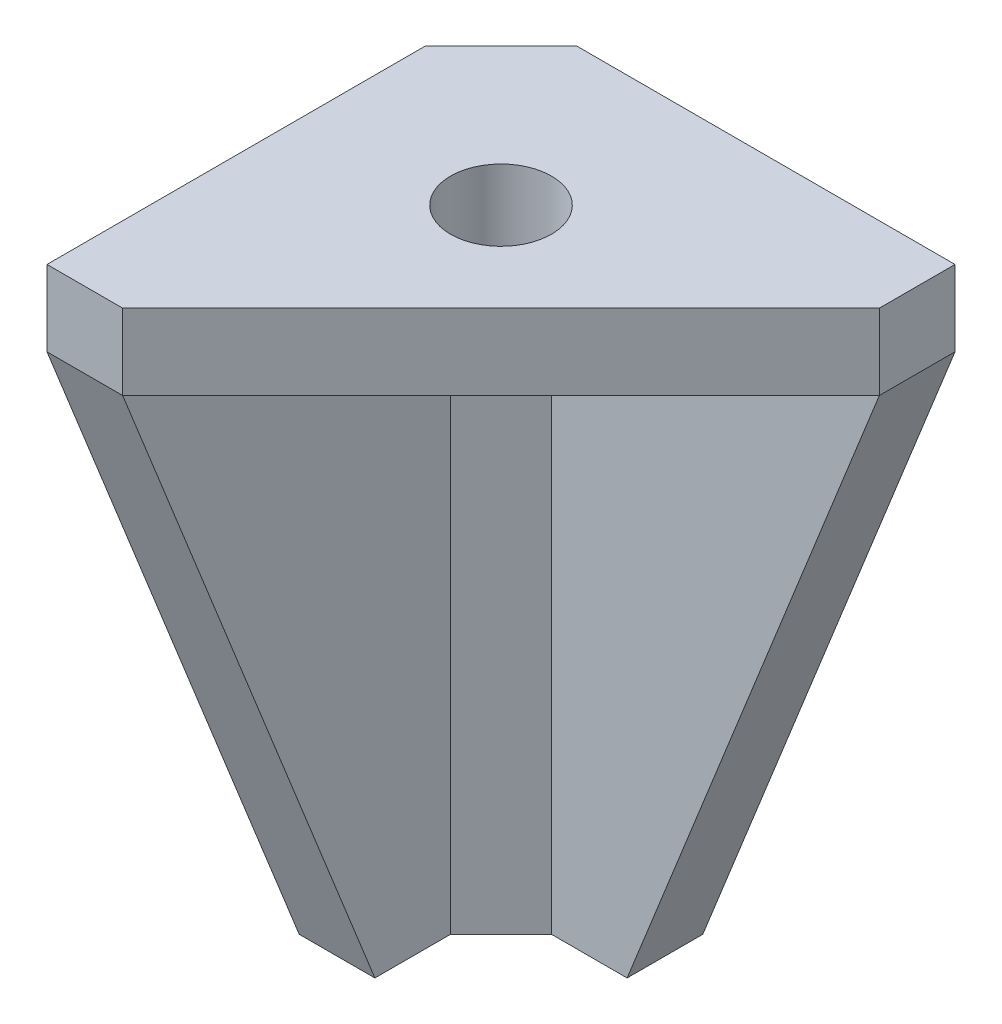
ISO-10303-21;
HEADER;
FILE_DESCRIPTION(('STEP AP214'),'2;1');
FILE_NAME('part.step','',(''),(''),'','','');
FILE_SCHEMA(('AUTOMOTIVE_DESIGN { 1 0 10303 214 1 1 1 1 }'));
ENDSEC;
DATA;
#1=APPLICATION_CONTEXT('core data for automotive mechanical design processes');
#2=APPLICATION_PROTOCOL_DEFINITION('international standard','automotive_design',2000,#1);
#3=PRODUCT_CONTEXT('',#1,'mechanical');
#4=PRODUCT('Part','Part','',(#3));
#5=PRODUCT_RELATED_PRODUCT_CATEGORY('part','',(#4));
#6=PRODUCT_DEFINITION_FORMATION('','',#4);
#7=PRODUCT_DEFINITION_CONTEXT('part definition',#1,'design');
#8=PRODUCT_DEFINITION('design','',#6,#7);
#9=PRODUCT_DEFINITION_SHAPE('','',#8);
#10=(LENGTH_UNIT() NAMED_UNIT(*) SI_UNIT(.MILLI.,.METRE.));
#11=(NAMED_UNIT(*) PLANE_ANGLE_UNIT() SI_UNIT($,.RADIAN.));
#12=(NAMED_UNIT(*) SI_UNIT($,.STERADIAN.) SOLID_ANGLE_UNIT());
#13=UNCERTAINTY_MEASURE_WITH_UNIT(LENGTH_MEASURE(1.E-05),#10,'distance_accuracy_value','');
#14=(GEOMETRIC_REPRESENTATION_CONTEXT(3) GLOBAL_UNCERTAINTY_ASSIGNED_CONTEXT((#13)) GLOBAL_UNIT_ASSIGNED_CONTEXT((#10,
#11,#12)) REPRESENTATION_CONTEXT('',''));
#15=CARTESIAN_POINT('',(0.,0.,0.));
#16=DIRECTION('',(0.,0.,1.));
#17=DIRECTION('',(1.,0.,0.));
#18=AXIS2_PLACEMENT_3D('',#15,#16,#17);
#19=CARTESIAN_POINT('',(0.,0.,3.));
#20=DIRECTION('',(0.,0.,1.));
#21=DIRECTION('',(1.,0.,0.));
#22=AXIS2_PLACEMENT_3D('',#19,#20,#21);
#23=PLANE('',#22);
#24=DIRECTION('',(-1.,0.,0.));
#25=VECTOR('',#24,1.);
#26=CARTESIAN_POINT('',(12.5,12.5,3.));
#27=LINE('',#26,#25);
#28=CARTESIAN_POINT('',(12.5,12.5,3.));
#29=VERTEX_POINT('',#28);
#30=CARTESIAN_POINT('',(-0.499999999999981,12.5,3.));
#31=VERTEX_POINT('',#30);
#32=EDGE_CURVE('E164',#29,#31,#27,.T.);
#33=ORIENTED_EDGE('',*,*,#32,.T.);
#34=DIRECTION('',(0.,-1.,0.));
#35=VECTOR('',#34,1.);
#36=CARTESIAN_POINT('',(-0.499999999999979,-12.5,3.));
#37=LINE('',#36,#35);
#38=CARTESIAN_POINT('',(-0.499999999999979,-12.5,3.));
#39=VERTEX_POINT('',#38);
#40=EDGE_CURVE('E184',#31,#39,#37,.T.);
#41=ORIENTED_EDGE('',*,*,#40,.T.);
#42=DIRECTION('',(1.,0.,0.));
#43=VECTOR('',#42,1.);
#44=CARTESIAN_POINT('',(-2.5,-12.5,3.));
#45=LINE('',#44,#43);
#46=CARTESIAN_POINT('',(2.5,-12.5,3.));
#47=VERTEX_POINT('',#46);
#48=EDGE_CURVE('E167',#39,#47,#45,.T.);
#49=ORIENTED_EDGE('',*,*,#48,.T.);
#50=DIRECTION('',(0.371390676354103,0.928476690885259,0.));
#51=VECTOR('',#50,1.);
#52=CARTESIAN_POINT('',(2.5,-12.5,3.));
#53=LINE('',#52,#51);
#54=EDGE_CURVE('E170',#47,#29,#53,.T.);
#55=ORIENTED_EDGE('',*,*,#54,.T.);
#56=EDGE_LOOP('',(#33,#41,#49,#55));
#57=FACE_BOUND('',#56,.T.);
#58=ADVANCED_FACE('F35',(#57),#23,.T.);
#59=CARTESIAN_POINT('',(-2.5,-12.5,3.));
#60=DIRECTION('',(0.,1.,0.));
#61=DIRECTION('',(0.,0.,1.));
#62=AXIS2_PLACEMENT_3D('',#59,#60,#61);
#63=PLANE('',#62);
#64=DIRECTION('',(1.,0.,0.));
#65=VECTOR('',#64,1.);
#66=CARTESIAN_POINT('',(-2.5,-12.5,0.));
#67=LINE('',#66,#65);
#68=CARTESIAN_POINT('',(-2.5,-12.5,0.));
#69=VERTEX_POINT('',#68);
#70=CARTESIAN_POINT('',(2.5,-12.5,0.));
#71=VERTEX_POINT('',#70);
#72=EDGE_CURVE('E176',#69,#71,#67,.T.);
#73=ORIENTED_EDGE('',*,*,#72,.T.);
#74=DIRECTION('',(0.,0.,-1.));
#75=VECTOR('',#74,1.);
#76=CARTESIAN_POINT('',(2.5,-12.5,3.));
#77=LINE('',#76,#75);
#78=EDGE_CURVE('E181',#47,#71,#77,.T.);
#79=ORIENTED_EDGE('',*,*,#78,.F.);
#80=ORIENTED_EDGE('',*,*,#48,.F.);
#81=DIRECTION('',(0.707106781186554,0.,-0.707106781186541));
#82=VECTOR('',#81,1.);
#83=CARTESIAN_POINT('',(-1.50000000000001,-12.5,4.00000000000001));
#84=LINE('',#83,#82);
#85=CARTESIAN_POINT('',(-2.50000000000001,-12.5,4.99999999999999));
#86=VERTEX_POINT('',#85);
#87=EDGE_CURVE('E11',#39,#86,#84,.F.);
#88=ORIENTED_EDGE('',*,*,#87,.T.);
#89=DIRECTION('',(0.,0.,1.));
#90=VECTOR('',#89,1.);
#91=CARTESIAN_POINT('',(-2.5,-12.5,3.));
#92=LINE('',#91,#90);
#93=CARTESIAN_POINT('',(-2.50000000000002,-12.5,8.));
#94=VERTEX_POINT('',#93);
#95=EDGE_CURVE('E147',#86,#94,#92,.T.);
#96=ORIENTED_EDGE('',*,*,#95,.T.);
#97=DIRECTION('',(-1.,0.,0.));
#98=VECTOR('',#97,1.);
#99=CARTESIAN_POINT('',(-2.50000000000002,-12.5,8.));
#100=LINE('',#99,#98);
#101=CARTESIAN_POINT('',(-5.50000000000002,-12.5,7.99999999999999));
#102=VERTEX_POINT('',#101);
#103=EDGE_CURVE('E155',#94,#102,#100,.T.);
#104=ORIENTED_EDGE('',*,*,#103,.T.);
#105=DIRECTION('',(0.,0.,1.));
#106=VECTOR('',#105,1.);
#107=CARTESIAN_POINT('',(-5.5,-12.5,2.99999999999999));
#108=LINE('',#107,#106);
#109=CARTESIAN_POINT('',(-5.5,-12.5,2.99999999999999));
#110=VERTEX_POINT('',#109);
#111=EDGE_CURVE('E138',#110,#102,#108,.T.);
#112=ORIENTED_EDGE('',*,*,#111,.F.);
#113=DIRECTION('',(-0.707106781186549,0.,0.707106781186546));
#114=VECTOR('',#113,1.);
#115=CARTESIAN_POINT('',(-5.50000000000001,-12.5,3.));
#116=LINE('',#115,#114);
#117=EDGE_CURVE('E158',#69,#110,#116,.T.);
#118=ORIENTED_EDGE('',*,*,#117,.F.);
#119=EDGE_LOOP('',(#73,#79,#80,#88,#96,#104,#112,#118));
#120=FACE_BOUND('',#119,.T.);
#121=ADVANCED_FACE('F205',(#120),#63,.F.);
#122=CARTESIAN_POINT('',(2.5,-12.5,3.));
#123=DIRECTION('',(-0.928476690885259,0.371390676354104,0.));
#124=DIRECTION('',(-0.371390676354104,-0.928476690885259,0.));
#125=AXIS2_PLACEMENT_3D('',#122,#123,#124);
#126=PLANE('',#125);
#127=DIRECTION('',(0.371390676354103,0.928476690885259,0.));
#128=VECTOR('',#127,1.);
#129=CARTESIAN_POINT('',(2.5,-12.5,0.));
#130=LINE('',#129,#128);
#131=CARTESIAN_POINT('',(12.5,12.5,0.));
#132=VERTEX_POINT('',#131);
#133=EDGE_CURVE('E168',#71,#132,#130,.T.);
#134=ORIENTED_EDGE('',*,*,#133,.T.);
#135=DIRECTION('',(0.,0.,-1.));
#136=VECTOR('',#135,1.);
#137=CARTESIAN_POINT('',(12.5,12.5,3.));
#138=LINE('',#137,#136);
#139=EDGE_CURVE('E173',#29,#132,#138,.T.);
#140=ORIENTED_EDGE('',*,*,#139,.F.);
#141=ORIENTED_EDGE('',*,*,#54,.F.);
#142=ORIENTED_EDGE('',*,*,#78,.T.);
#143=EDGE_LOOP('',(#134,#140,#141,#142));
#144=FACE_BOUND('',#143,.T.);
#145=ADVANCED_FACE('F210',(#144),#126,.F.);
#146=CARTESIAN_POINT('',(0.,0.,0.));
#147=DIRECTION('',(0.,0.,1.));
#148=DIRECTION('',(1.,0.,0.));
#149=AXIS2_PLACEMENT_3D('',#146,#147,#148);
#150=PLANE('',#149);
#151=DIRECTION('',(0.,-1.,0.));
#152=VECTOR('',#151,1.);
#153=CARTESIAN_POINT('',(-2.5,12.5,0.));
#154=LINE('',#153,#152);
#155=CARTESIAN_POINT('',(-2.5,15.5,0.));
#156=VERTEX_POINT('',#155);
#157=EDGE_CURVE('E163',#156,#69,#154,.T.);
#158=ORIENTED_EDGE('',*,*,#157,.F.);
#159=DIRECTION('',(-1.,0.,0.));
#160=VECTOR('',#159,1.);
#161=CARTESIAN_POINT('',(12.5,15.5,0.));
#162=LINE('',#161,#160);
#163=CARTESIAN_POINT('',(12.5,15.5,0.));
#164=VERTEX_POINT('',#163);
#165=EDGE_CURVE('E229',#164,#156,#162,.T.);
#166=ORIENTED_EDGE('',*,*,#165,.F.);
#167=DIRECTION('',(0.,-1.,0.));
#168=VECTOR('',#167,1.);
#169=CARTESIAN_POINT('',(12.5,15.5,0.));
#170=LINE('',#169,#168);
#171=EDGE_CURVE('E228',#164,#132,#170,.T.);
#172=ORIENTED_EDGE('',*,*,#171,.T.);
#173=ORIENTED_EDGE('',*,*,#133,.F.);
#174=ORIENTED_EDGE('',*,*,#72,.F.);
#175=EDGE_LOOP('',(#158,#166,#172,#173,#174));
#176=FACE_BOUND('',#175,.T.);
#177=ADVANCED_FACE('F215',(#176),#150,.F.);
#178=CARTESIAN_POINT('',(-5.50000000000001,-12.5,3.));
#179=DIRECTION('',(-0.707106781186546,0.,-0.707106781186549));
#180=DIRECTION('',(-0.707106781186549,0.,0.707106781186546));
#181=AXIS2_PLACEMENT_3D('',#178,#179,#180);
#182=PLANE('',#181);
#183=DIRECTION('',(0.,1.,0.));
#184=VECTOR('',#183,1.);
#185=CARTESIAN_POINT('',(-5.50000000000001,-12.5,3.));
#186=LINE('',#185,#184);
#187=CARTESIAN_POINT('',(-5.50000000000001,15.5,2.99999999999999));
#188=VERTEX_POINT('',#187);
#189=EDGE_CURVE('E161',#110,#188,#186,.T.);
#190=ORIENTED_EDGE('',*,*,#189,.T.);
#191=DIRECTION('',(-0.707106781186549,0.,0.707106781186546));
#192=VECTOR('',#191,1.);
#193=CARTESIAN_POINT('',(-2.5,15.5,0.));
#194=LINE('',#193,#192);
#195=EDGE_CURVE('E129',#156,#188,#194,.T.);
#196=ORIENTED_EDGE('',*,*,#195,.F.);
#197=ORIENTED_EDGE('',*,*,#157,.T.);
#198=ORIENTED_EDGE('',*,*,#117,.T.);
#199=EDGE_LOOP('',(#190,#196,#197,#198));
#200=FACE_BOUND('',#199,.T.);
#201=ADVANCED_FACE('F213',(#200),#182,.T.);
#202=CARTESIAN_POINT('',(-2.50000000000002,-12.5,8.));
#203=DIRECTION('',(0.,0.371390676354104,-0.928476690885259));
#204=DIRECTION('',(0.,-0.928476690885259,-0.371390676354104));
#205=AXIS2_PLACEMENT_3D('',#202,#203,#204);
#206=PLANE('',#205);
#207=DIRECTION('',(0.,0.928476690885259,0.371390676354104));
#208=VECTOR('',#207,1.);
#209=CARTESIAN_POINT('',(-5.50000000000002,-12.5,7.99999999999999));
#210=LINE('',#209,#208);
#211=CARTESIAN_POINT('',(-5.50000000000006,12.5,18.));
#212=VERTEX_POINT('',#211);
#213=EDGE_CURVE('E136',#102,#212,#210,.T.);
#214=ORIENTED_EDGE('',*,*,#213,.F.);
#215=ORIENTED_EDGE('',*,*,#103,.F.);
#216=DIRECTION('',(0.,0.928476690885259,0.371390676354104));
#217=VECTOR('',#216,1.);
#218=CARTESIAN_POINT('',(-2.50000000000002,-12.5,8.));
#219=LINE('',#218,#217);
#220=CARTESIAN_POINT('',(-2.50000000000006,12.5,18.));
#221=VERTEX_POINT('',#220);
#222=EDGE_CURVE('E149',#94,#221,#219,.T.);
#223=ORIENTED_EDGE('',*,*,#222,.T.);
#224=DIRECTION('',(-1.,0.,0.));
#225=VECTOR('',#224,1.);
#226=CARTESIAN_POINT('',(-2.50000000000006,12.5,18.));
#227=LINE('',#226,#225);
#228=EDGE_CURVE('E151',#221,#212,#227,.T.);
#229=ORIENTED_EDGE('',*,*,#228,.T.);
#230=EDGE_LOOP('',(#214,#215,#223,#229));
#231=FACE_BOUND('',#230,.T.);
#232=ADVANCED_FACE('F269',(#231),#206,.F.);
#233=CARTESIAN_POINT('',(-2.50000000000001,0.,5.5));
#234=DIRECTION('',(1.,0.,0.));
#235=DIRECTION('',(0.,0.,1.));
#236=AXIS2_PLACEMENT_3D('',#233,#234,#235);
#237=PLANE('',#236);
#238=ORIENTED_EDGE('',*,*,#95,.F.);
#239=DIRECTION('',(0.,1.,0.));
#240=VECTOR('',#239,1.);
#241=CARTESIAN_POINT('',(-2.50000000000001,12.5,4.99999999999999));
#242=LINE('',#241,#240);
#243=CARTESIAN_POINT('',(-2.50000000000001,12.5,4.99999999999999));
#244=VERTEX_POINT('',#243);
#245=EDGE_CURVE('E56',#86,#244,#242,.T.);
#246=ORIENTED_EDGE('',*,*,#245,.T.);
#247=DIRECTION('',(0.,0.,-1.));
#248=VECTOR('',#247,1.);
#249=CARTESIAN_POINT('',(-2.50000000000006,12.5,18.));
#250=LINE('',#249,#248);
#251=EDGE_CURVE('E145',#221,#244,#250,.T.);
#252=ORIENTED_EDGE('',*,*,#251,.F.);
#253=ORIENTED_EDGE('',*,*,#222,.F.);
#254=EDGE_LOOP('',(#238,#246,#252,#253));
#255=FACE_BOUND('',#254,.T.);
#256=ADVANCED_FACE('F266',(#255),#237,.T.);
#257=CARTESIAN_POINT('',(-5.50000000000001,0.,5.49999999999999));
#258=DIRECTION('',(1.,0.,0.));
#259=DIRECTION('',(0.,0.,1.));
#260=AXIS2_PLACEMENT_3D('',#257,#258,#259);
#261=PLANE('',#260);
#262=ORIENTED_EDGE('',*,*,#213,.T.);
#263=DIRECTION('',(0.,-1.,0.));
#264=VECTOR('',#263,1.);
#265=CARTESIAN_POINT('',(-5.50000000000006,15.5,18.));
#266=LINE('',#265,#264);
#267=CARTESIAN_POINT('',(-5.50000000000006,15.5,18.));
#268=VERTEX_POINT('',#267);
#269=EDGE_CURVE('E115',#268,#212,#266,.T.);
#270=ORIENTED_EDGE('',*,*,#269,.F.);
#271=DIRECTION('',(0.,0.,1.));
#272=VECTOR('',#271,1.);
#273=CARTESIAN_POINT('',(-5.50000000000001,15.5,2.99999999999999));
#274=LINE('',#273,#272);
#275=EDGE_CURVE('E122',#188,#268,#274,.T.);
#276=ORIENTED_EDGE('',*,*,#275,.F.);
#277=ORIENTED_EDGE('',*,*,#189,.F.);
#278=ORIENTED_EDGE('',*,*,#111,.T.);
#279=EDGE_LOOP('',(#262,#270,#276,#277,#278));
#280=FACE_BOUND('',#279,.T.);
#281=ADVANCED_FACE('F134',(#280),#261,.F.);
#282=CARTESIAN_POINT('',(0.,12.5,0.));
#283=DIRECTION('',(0.,1.,0.));
#284=DIRECTION('',(0.,0.,1.));
#285=AXIS2_PLACEMENT_3D('',#282,#283,#284);
#286=PLANE('',#285);
#287=CARTESIAN_POINT('',(1.46446609406724,12.5,6.96446609406726));
#288=DIRECTION('',(0.,1.,0.));
#289=DIRECTION('',(0.,0.,1.));
#290=AXIS2_PLACEMENT_3D('',#287,#288,#289);
#291=CIRCLE('',#290,1.99999999999999);
#292=CARTESIAN_POINT('',(1.46446609406724,12.5,8.96446609406725));
#293=VERTEX_POINT('',#292);
#294=EDGE_CURVE('E236',#293,#293,#291,.T.);
#295=ORIENTED_EDGE('',*,*,#294,.T.);
#296=EDGE_LOOP('',(#295));
#297=FACE_BOUND('',#296,.T.);
#298=ORIENTED_EDGE('',*,*,#251,.T.);
#299=DIRECTION('',(-0.707106781186554,0.,0.707106781186541));
#300=VECTOR('',#299,1.);
#301=CARTESIAN_POINT('',(-0.499999999999981,12.5,3.));
#302=LINE('',#301,#300);
#303=EDGE_CURVE('E44',#244,#31,#302,.F.);
#304=ORIENTED_EDGE('',*,*,#303,.T.);
#305=ORIENTED_EDGE('',*,*,#32,.F.);
#306=DIRECTION('',(0.707106781186549,0.,-0.707106781186546));
#307=VECTOR('',#306,1.);
#308=CARTESIAN_POINT('',(-2.50000000000006,12.5,18.));
#309=LINE('',#308,#307);
#310=EDGE_CURVE('E132',#221,#29,#309,.T.);
#311=ORIENTED_EDGE('',*,*,#310,.F.);
#312=EDGE_LOOP('',(#298,#304,#305,#311));
#313=FACE_BOUND('',#312,.T.);
#314=ADVANCED_FACE('F189',(#297,#313),#286,.F.);
#315=CARTESIAN_POINT('',(-5.50000000000006,15.5,18.));
#316=DIRECTION('',(0.,0.,-1.));
#317=DIRECTION('',(-1.,0.,0.));
#318=AXIS2_PLACEMENT_3D('',#315,#316,#317);
#319=PLANE('',#318);
#320=ORIENTED_EDGE('',*,*,#228,.F.);
#321=DIRECTION('',(0.,-1.,0.));
#322=VECTOR('',#321,1.);
#323=CARTESIAN_POINT('',(-2.50000000000006,15.5,18.));
#324=LINE('',#323,#322);
#325=CARTESIAN_POINT('',(-2.50000000000006,15.5,18.));
#326=VERTEX_POINT('',#325);
#327=EDGE_CURVE('E118',#326,#221,#324,.T.);
#328=ORIENTED_EDGE('',*,*,#327,.F.);
#329=DIRECTION('',(1.,0.,0.));
#330=VECTOR('',#329,1.);
#331=CARTESIAN_POINT('',(-5.50000000000006,15.5,18.));
#332=LINE('',#331,#330);
#333=EDGE_CURVE('E111',#268,#326,#332,.T.);
#334=ORIENTED_EDGE('',*,*,#333,.F.);
#335=ORIENTED_EDGE('',*,*,#269,.T.);
#336=EDGE_LOOP('',(#320,#328,#334,#335));
#337=FACE_BOUND('',#336,.T.);
#338=ADVANCED_FACE('F113',(#337),#319,.F.);
#339=CARTESIAN_POINT('',(-2.50000000000006,15.5,18.));
#340=DIRECTION('',(-0.707106781186546,0.,-0.707106781186549));
#341=DIRECTION('',(-0.707106781186549,0.,0.707106781186546));
#342=AXIS2_PLACEMENT_3D('',#339,#340,#341);
#343=PLANE('',#342);
#344=ORIENTED_EDGE('',*,*,#310,.T.);
#345=DIRECTION('',(0.,-1.,0.));
#346=VECTOR('',#345,1.);
#347=CARTESIAN_POINT('',(12.5,15.5,3.));
#348=LINE('',#347,#346);
#349=CARTESIAN_POINT('',(12.5,15.5,3.));
#350=VERTEX_POINT('',#349);
#351=EDGE_CURVE('E141',#350,#29,#348,.T.);
#352=ORIENTED_EDGE('',*,*,#351,.F.);
#353=DIRECTION('',(0.707106781186549,0.,-0.707106781186546));
#354=VECTOR('',#353,1.);
#355=CARTESIAN_POINT('',(-2.50000000000006,15.5,18.));
#356=LINE('',#355,#354);
#357=EDGE_CURVE('E121',#326,#350,#356,.T.);
#358=ORIENTED_EDGE('',*,*,#357,.F.);
#359=ORIENTED_EDGE('',*,*,#327,.T.);
#360=EDGE_LOOP('',(#344,#352,#358,#359));
#361=FACE_BOUND('',#360,.T.);
#362=ADVANCED_FACE('F255',(#361),#343,.F.);
#363=CARTESIAN_POINT('',(12.5,15.5,3.));
#364=DIRECTION('',(-1.,0.,0.));
#365=DIRECTION('',(0.,-1.,0.));
#366=AXIS2_PLACEMENT_3D('',#363,#364,#365);
#367=PLANE('',#366);
#368=ORIENTED_EDGE('',*,*,#139,.T.);
#369=ORIENTED_EDGE('',*,*,#171,.F.);
#370=DIRECTION('',(0.,0.,-1.));
#371=VECTOR('',#370,1.);
#372=CARTESIAN_POINT('',(12.5,15.5,3.));
#373=LINE('',#372,#371);
#374=EDGE_CURVE('E239',#350,#164,#373,.T.);
#375=ORIENTED_EDGE('',*,*,#374,.F.);
#376=ORIENTED_EDGE('',*,*,#351,.T.);
#377=EDGE_LOOP('',(#368,#369,#375,#376));
#378=FACE_BOUND('',#377,.T.);
#379=ADVANCED_FACE('F250',(#378),#367,.F.);
#380=CARTESIAN_POINT('',(0.,15.5,0.));
#381=DIRECTION('',(0.,1.,0.));
#382=DIRECTION('',(0.,0.,1.));
#383=AXIS2_PLACEMENT_3D('',#380,#381,#382);
#384=PLANE('',#383);
#385=CARTESIAN_POINT('',(1.46446609406724,15.5,6.96446609406726));
#386=DIRECTION('',(0.,1.,0.));
#387=DIRECTION('',(0.,0.,1.));
#388=AXIS2_PLACEMENT_3D('',#385,#386,#387);
#389=CIRCLE('',#388,1.99999999999999);
#390=CARTESIAN_POINT('',(1.46446609406724,15.5,8.96446609406724));
#391=VERTEX_POINT('',#390);
#392=EDGE_CURVE('E244',#391,#391,#389,.T.);
#393=ORIENTED_EDGE('',*,*,#392,.F.);
#394=EDGE_LOOP('',(#393));
#395=FACE_BOUND('',#394,.T.);
#396=ORIENTED_EDGE('',*,*,#275,.T.);
#397=ORIENTED_EDGE('',*,*,#333,.T.);
#398=ORIENTED_EDGE('',*,*,#357,.T.);
#399=ORIENTED_EDGE('',*,*,#374,.T.);
#400=ORIENTED_EDGE('',*,*,#165,.T.);
#401=ORIENTED_EDGE('',*,*,#195,.T.);
#402=EDGE_LOOP('',(#396,#397,#398,#399,#400,#401));
#403=FACE_BOUND('',#402,.T.);
#404=ADVANCED_FACE('F126',(#395,#403),#384,.T.);
#405=CARTESIAN_POINT('',(1.46446609406724,15.5,6.96446609406726));
#406=DIRECTION('',(0.,1.,0.));
#407=DIRECTION('',(0.,0.,1.));
#408=AXIS2_PLACEMENT_3D('',#405,#406,#407);
#409=CYLINDRICAL_SURFACE('',#408,1.99999999999999);
#410=ORIENTED_EDGE('',*,*,#392,.T.);
#411=EDGE_LOOP('',(#410));
#412=FACE_BOUND('',#411,.T.);
#413=ORIENTED_EDGE('',*,*,#294,.F.);
#414=EDGE_LOOP('',(#413));
#415=FACE_BOUND('',#414,.T.);
#416=ADVANCED_FACE('F198',(#412,#415),#409,.F.);
#417=CARTESIAN_POINT('',(-0.49999999999998,0.,3.));
#418=DIRECTION('',(0.707106781186541,0.,0.707106781186554));
#419=DIRECTION('',(0.,1.,0.));
#420=AXIS2_PLACEMENT_3D('',#417,#418,#419);
#421=PLANE('',#420);
#422=ORIENTED_EDGE('',*,*,#303,.F.);
#423=ORIENTED_EDGE('',*,*,#245,.F.);
#424=ORIENTED_EDGE('',*,*,#87,.F.);
#425=ORIENTED_EDGE('',*,*,#40,.F.);
#426=EDGE_LOOP('',(#422,#423,#424,#425));
#427=FACE_BOUND('',#426,.T.);
#428=ADVANCED_FACE('F38',(#427),#421,.T.);
#429=CLOSED_SHELL('',(#58,#121,#145,#177,#201,#232,#256,#281,#314,#338,#362,#379,#404,#416,#428));
#430=MANIFOLD_SOLID_BREP('B2',#429);
#431=ADVANCED_BREP_SHAPE_REPRESENTATION('',(#18,#430),#14);
#432=SHAPE_DEFINITION_REPRESENTATION(#9,#431);
ENDSEC;
END-ISO-10303-21;
